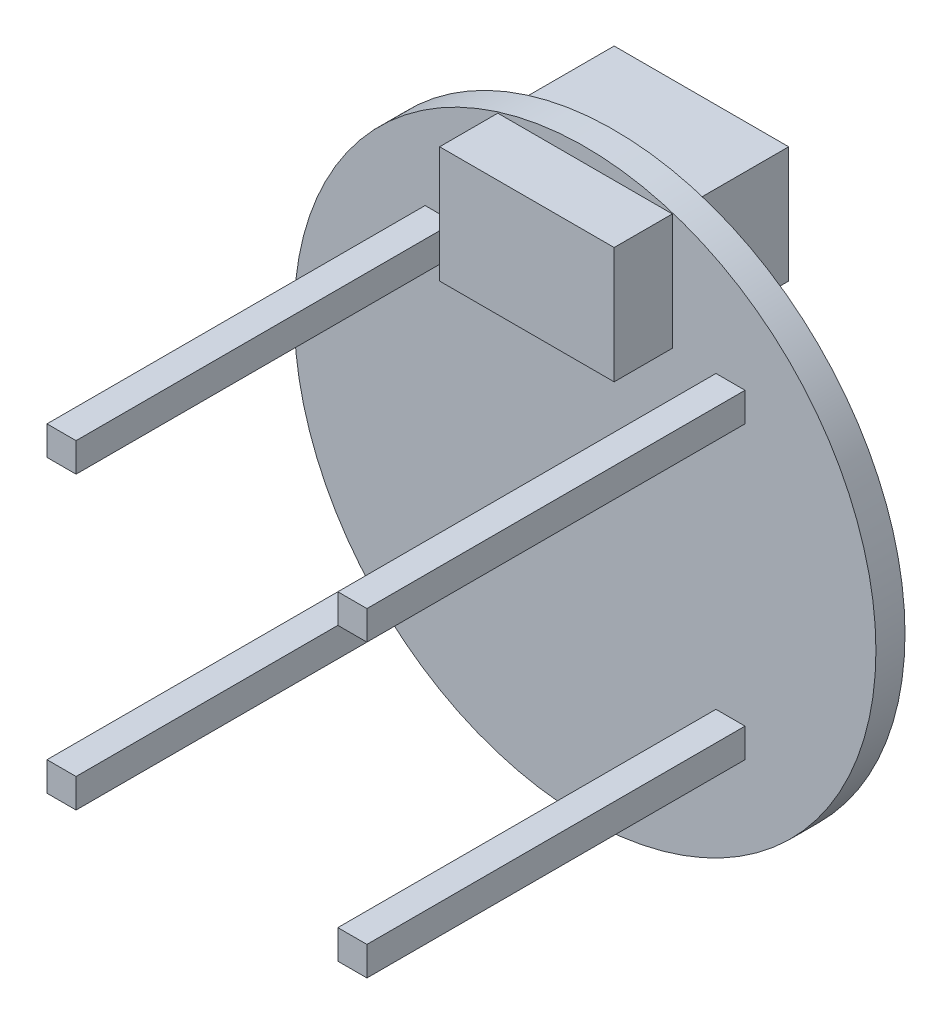
ISO-10303-21;
HEADER;
FILE_DESCRIPTION(('STEP AP214'),'2;1');
FILE_NAME('part.step','',(''),(''),'','','');
FILE_SCHEMA(('AUTOMOTIVE_DESIGN { 1 0 10303 214 1 1 1 1 }'));
ENDSEC;
DATA;
#1=APPLICATION_CONTEXT('core data for automotive mechanical design processes');
#2=APPLICATION_PROTOCOL_DEFINITION('international standard','automotive_design',2000,#1);
#3=PRODUCT_CONTEXT('',#1,'mechanical');
#4=PRODUCT('Part','Part','',(#3));
#5=PRODUCT_RELATED_PRODUCT_CATEGORY('part','',(#4));
#6=PRODUCT_DEFINITION_FORMATION('','',#4);
#7=PRODUCT_DEFINITION_CONTEXT('part definition',#1,'design');
#8=PRODUCT_DEFINITION('design','',#6,#7);
#9=PRODUCT_DEFINITION_SHAPE('','',#8);
#10=(LENGTH_UNIT() NAMED_UNIT(*) SI_UNIT(.MILLI.,.METRE.));
#11=(NAMED_UNIT(*) PLANE_ANGLE_UNIT() SI_UNIT($,.RADIAN.));
#12=(NAMED_UNIT(*) SI_UNIT($,.STERADIAN.) SOLID_ANGLE_UNIT());
#13=UNCERTAINTY_MEASURE_WITH_UNIT(LENGTH_MEASURE(1.E-05),#10,'distance_accuracy_value','');
#14=(GEOMETRIC_REPRESENTATION_CONTEXT(3) GLOBAL_UNCERTAINTY_ASSIGNED_CONTEXT((#13)) GLOBAL_UNIT_ASSIGNED_CONTEXT((#10,
#11,#12)) REPRESENTATION_CONTEXT('',''));
#15=CARTESIAN_POINT('',(0.,0.,0.));
#16=DIRECTION('',(0.,0.,1.));
#17=DIRECTION('',(1.,0.,0.));
#18=AXIS2_PLACEMENT_3D('',#15,#16,#17);
#19=CARTESIAN_POINT('',(0.,0.,50.));
#20=DIRECTION('',(0.,0.,1.));
#21=DIRECTION('',(1.,0.,0.));
#22=AXIS2_PLACEMENT_3D('',#19,#20,#21);
#23=PLANE('',#22);
#24=CARTESIAN_POINT('',(0.,0.,50.));
#25=DIRECTION('',(0.,0.,1.));
#26=DIRECTION('',(1.,0.,0.));
#27=AXIS2_PLACEMENT_3D('',#24,#25,#26);
#28=CIRCLE('',#27,500.);
#29=CARTESIAN_POINT('',(500.,0.,50.));
#30=VERTEX_POINT('',#29);
#31=EDGE_CURVE('E365',#30,#30,#28,.T.);
#32=ORIENTED_EDGE('',*,*,#31,.T.);
#33=EDGE_LOOP('',(#32));
#34=FACE_BOUND('',#33,.T.);
#35=DIRECTION('',(1.,0.,0.));
#36=VECTOR('',#35,1.);
#37=CARTESIAN_POINT('',(0.,275.,50.));
#38=LINE('',#37,#36);
#39=CARTESIAN_POINT('',(225.,275.,50.));
#40=VERTEX_POINT('',#39);
#41=CARTESIAN_POINT('',(275.,275.,50.));
#42=VERTEX_POINT('',#41);
#43=EDGE_CURVE('E358',#40,#42,#38,.T.);
#44=ORIENTED_EDGE('',*,*,#43,.T.);
#45=DIRECTION('',(0.,-1.,0.));
#46=VECTOR('',#45,1.);
#47=CARTESIAN_POINT('',(275.,0.,50.));
#48=LINE('',#47,#46);
#49=CARTESIAN_POINT('',(275.,225.,50.));
#50=VERTEX_POINT('',#49);
#51=EDGE_CURVE('E361',#42,#50,#48,.T.);
#52=ORIENTED_EDGE('',*,*,#51,.T.);
#53=DIRECTION('',(-1.,0.,0.));
#54=VECTOR('',#53,1.);
#55=CARTESIAN_POINT('',(0.,225.,50.));
#56=LINE('',#55,#54);
#57=CARTESIAN_POINT('',(225.,225.,50.));
#58=VERTEX_POINT('',#57);
#59=EDGE_CURVE('E352',#50,#58,#56,.T.);
#60=ORIENTED_EDGE('',*,*,#59,.T.);
#61=DIRECTION('',(0.,1.,0.));
#62=VECTOR('',#61,1.);
#63=CARTESIAN_POINT('',(225.,0.,50.));
#64=LINE('',#63,#62);
#65=EDGE_CURVE('E355',#58,#40,#64,.T.);
#66=ORIENTED_EDGE('',*,*,#65,.T.);
#67=EDGE_LOOP('',(#44,#52,#60,#66));
#68=FACE_BOUND('',#67,.T.);
#69=DIRECTION('',(1.,0.,0.));
#70=VECTOR('',#69,1.);
#71=CARTESIAN_POINT('',(0.,275.,50.));
#72=LINE('',#71,#70);
#73=CARTESIAN_POINT('',(-275.,275.,50.));
#74=VERTEX_POINT('',#73);
#75=CARTESIAN_POINT('',(-225.,275.,50.));
#76=VERTEX_POINT('',#75);
#77=EDGE_CURVE('E326',#74,#76,#72,.T.);
#78=ORIENTED_EDGE('',*,*,#77,.T.);
#79=DIRECTION('',(0.,-1.,0.));
#80=VECTOR('',#79,1.);
#81=CARTESIAN_POINT('',(-225.,0.,50.));
#82=LINE('',#81,#80);
#83=CARTESIAN_POINT('',(-225.,225.,50.));
#84=VERTEX_POINT('',#83);
#85=EDGE_CURVE('E329',#76,#84,#82,.T.);
#86=ORIENTED_EDGE('',*,*,#85,.T.);
#87=DIRECTION('',(-1.,0.,0.));
#88=VECTOR('',#87,1.);
#89=CARTESIAN_POINT('',(0.,225.,50.));
#90=LINE('',#89,#88);
#91=CARTESIAN_POINT('',(-275.,225.,50.));
#92=VERTEX_POINT('',#91);
#93=EDGE_CURVE('E320',#84,#92,#90,.T.);
#94=ORIENTED_EDGE('',*,*,#93,.T.);
#95=DIRECTION('',(0.,1.,0.));
#96=VECTOR('',#95,1.);
#97=CARTESIAN_POINT('',(-275.,0.,50.));
#98=LINE('',#97,#96);
#99=EDGE_CURVE('E323',#92,#74,#98,.T.);
#100=ORIENTED_EDGE('',*,*,#99,.T.);
#101=EDGE_LOOP('',(#78,#86,#94,#100));
#102=FACE_BOUND('',#101,.T.);
#103=DIRECTION('',(1.,0.,0.));
#104=VECTOR('',#103,1.);
#105=CARTESIAN_POINT('',(0.,-225.,50.));
#106=LINE('',#105,#104);
#107=CARTESIAN_POINT('',(225.,-225.,50.));
#108=VERTEX_POINT('',#107);
#109=CARTESIAN_POINT('',(275.,-225.,50.));
#110=VERTEX_POINT('',#109);
#111=EDGE_CURVE('E294',#108,#110,#106,.T.);
#112=ORIENTED_EDGE('',*,*,#111,.T.);
#113=DIRECTION('',(0.,-1.,0.));
#114=VECTOR('',#113,1.);
#115=CARTESIAN_POINT('',(275.,0.,50.));
#116=LINE('',#115,#114);
#117=CARTESIAN_POINT('',(275.,-275.,50.));
#118=VERTEX_POINT('',#117);
#119=EDGE_CURVE('E297',#110,#118,#116,.T.);
#120=ORIENTED_EDGE('',*,*,#119,.T.);
#121=DIRECTION('',(-1.,0.,0.));
#122=VECTOR('',#121,1.);
#123=CARTESIAN_POINT('',(0.,-275.,50.));
#124=LINE('',#123,#122);
#125=CARTESIAN_POINT('',(225.,-275.,50.));
#126=VERTEX_POINT('',#125);
#127=EDGE_CURVE('E288',#118,#126,#124,.T.);
#128=ORIENTED_EDGE('',*,*,#127,.T.);
#129=DIRECTION('',(0.,1.,0.));
#130=VECTOR('',#129,1.);
#131=CARTESIAN_POINT('',(225.,0.,50.));
#132=LINE('',#131,#130);
#133=EDGE_CURVE('E291',#126,#108,#132,.T.);
#134=ORIENTED_EDGE('',*,*,#133,.T.);
#135=EDGE_LOOP('',(#112,#120,#128,#134));
#136=FACE_BOUND('',#135,.T.);
#137=DIRECTION('',(1.,0.,0.));
#138=VECTOR('',#137,1.);
#139=CARTESIAN_POINT('',(0.,-225.,50.));
#140=LINE('',#139,#138);
#141=CARTESIAN_POINT('',(-275.,-225.,50.));
#142=VERTEX_POINT('',#141);
#143=CARTESIAN_POINT('',(-225.,-225.,50.));
#144=VERTEX_POINT('',#143);
#145=EDGE_CURVE('E262',#142,#144,#140,.T.);
#146=ORIENTED_EDGE('',*,*,#145,.T.);
#147=DIRECTION('',(0.,-1.,0.));
#148=VECTOR('',#147,1.);
#149=CARTESIAN_POINT('',(-225.,0.,50.));
#150=LINE('',#149,#148);
#151=CARTESIAN_POINT('',(-225.,-275.,50.));
#152=VERTEX_POINT('',#151);
#153=EDGE_CURVE('E265',#144,#152,#150,.T.);
#154=ORIENTED_EDGE('',*,*,#153,.T.);
#155=DIRECTION('',(-1.,0.,0.));
#156=VECTOR('',#155,1.);
#157=CARTESIAN_POINT('',(0.,-275.,50.));
#158=LINE('',#157,#156);
#159=CARTESIAN_POINT('',(-275.,-275.,50.));
#160=VERTEX_POINT('',#159);
#161=EDGE_CURVE('E256',#152,#160,#158,.T.);
#162=ORIENTED_EDGE('',*,*,#161,.T.);
#163=DIRECTION('',(0.,1.,0.));
#164=VECTOR('',#163,1.);
#165=CARTESIAN_POINT('',(-275.,0.,50.));
#166=LINE('',#165,#164);
#167=EDGE_CURVE('E259',#160,#142,#166,.T.);
#168=ORIENTED_EDGE('',*,*,#167,.T.);
#169=EDGE_LOOP('',(#146,#154,#162,#168));
#170=FACE_BOUND('',#169,.T.);
#171=DIRECTION('',(0.,1.,0.));
#172=VECTOR('',#171,1.);
#173=CARTESIAN_POINT('',(-150.,0.,50.));
#174=LINE('',#173,#172);
#175=CARTESIAN_POINT('',(-150.,275.,50.));
#176=VERTEX_POINT('',#175);
#177=CARTESIAN_POINT('',(-150.,475.,50.));
#178=VERTEX_POINT('',#177);
#179=EDGE_CURVE('E61',#176,#178,#174,.T.);
#180=ORIENTED_EDGE('',*,*,#179,.T.);
#181=DIRECTION('',(1.,0.,0.));
#182=VECTOR('',#181,1.);
#183=CARTESIAN_POINT('',(0.,475.,50.));
#184=LINE('',#183,#182);
#185=CARTESIAN_POINT('',(150.,475.,50.));
#186=VERTEX_POINT('',#185);
#187=EDGE_CURVE('E56',#178,#186,#184,.T.);
#188=ORIENTED_EDGE('',*,*,#187,.T.);
#189=DIRECTION('',(0.,-1.,0.));
#190=VECTOR('',#189,1.);
#191=CARTESIAN_POINT('',(150.,0.,50.));
#192=LINE('',#191,#190);
#193=CARTESIAN_POINT('',(150.,275.,50.));
#194=VERTEX_POINT('',#193);
#195=EDGE_CURVE('E234',#186,#194,#192,.T.);
#196=ORIENTED_EDGE('',*,*,#195,.T.);
#197=DIRECTION('',(1.,0.,0.));
#198=VECTOR('',#197,1.);
#199=CARTESIAN_POINT('',(0.,275.,50.));
#200=LINE('',#199,#198);
#201=EDGE_CURVE('E224',#176,#194,#200,.T.);
#202=ORIENTED_EDGE('',*,*,#201,.F.);
#203=EDGE_LOOP('',(#180,#188,#196,#202));
#204=FACE_BOUND('',#203,.T.);
#205=ADVANCED_FACE('F41',(#34,#68,#102,#136,#170,#204),#23,.T.);
#206=CARTESIAN_POINT('',(0.,0.,0.));
#207=DIRECTION('',(0.,0.,1.));
#208=DIRECTION('',(1.,0.,0.));
#209=AXIS2_PLACEMENT_3D('',#206,#207,#208);
#210=PLANE('',#209);
#211=CARTESIAN_POINT('',(0.,0.,0.));
#212=DIRECTION('',(0.,0.,1.));
#213=DIRECTION('',(1.,0.,0.));
#214=AXIS2_PLACEMENT_3D('',#211,#212,#213);
#215=CIRCLE('',#214,500.);
#216=CARTESIAN_POINT('',(500.,0.,0.));
#217=VERTEX_POINT('',#216);
#218=EDGE_CURVE('E364',#217,#217,#215,.T.);
#219=ORIENTED_EDGE('',*,*,#218,.F.);
#220=EDGE_LOOP('',(#219));
#221=FACE_BOUND('',#220,.T.);
#222=DIRECTION('',(1.,0.,0.));
#223=VECTOR('',#222,1.);
#224=CARTESIAN_POINT('',(0.,475.,0.));
#225=LINE('',#224,#223);
#226=CARTESIAN_POINT('',(-150.,475.,0.));
#227=VERTEX_POINT('',#226);
#228=CARTESIAN_POINT('',(150.,475.,0.));
#229=VERTEX_POINT('',#228);
#230=EDGE_CURVE('E11',#227,#229,#225,.T.);
#231=ORIENTED_EDGE('',*,*,#230,.F.);
#232=DIRECTION('',(0.,1.,0.));
#233=VECTOR('',#232,1.);
#234=CARTESIAN_POINT('',(-150.,0.,0.));
#235=LINE('',#234,#233);
#236=CARTESIAN_POINT('',(-150.,275.,0.));
#237=VERTEX_POINT('',#236);
#238=EDGE_CURVE('E373',#237,#227,#235,.T.);
#239=ORIENTED_EDGE('',*,*,#238,.F.);
#240=DIRECTION('',(1.,0.,0.));
#241=VECTOR('',#240,1.);
#242=CARTESIAN_POINT('',(0.,275.,0.));
#243=LINE('',#242,#241);
#244=CARTESIAN_POINT('',(150.,275.,0.));
#245=VERTEX_POINT('',#244);
#246=EDGE_CURVE('E368',#237,#245,#243,.T.);
#247=ORIENTED_EDGE('',*,*,#246,.T.);
#248=DIRECTION('',(0.,-1.,0.));
#249=VECTOR('',#248,1.);
#250=CARTESIAN_POINT('',(150.,0.,0.));
#251=LINE('',#250,#249);
#252=EDGE_CURVE('E49',#229,#245,#251,.T.);
#253=ORIENTED_EDGE('',*,*,#252,.F.);
#254=EDGE_LOOP('',(#231,#239,#247,#253));
#255=FACE_BOUND('',#254,.T.);
#256=ADVANCED_FACE('F376',(#221,#255),#210,.F.);
#257=CARTESIAN_POINT('',(0.,0.,50.));
#258=DIRECTION('',(0.,0.,-1.));
#259=DIRECTION('',(-1.,0.,0.));
#260=AXIS2_PLACEMENT_3D('',#257,#258,#259);
#261=CYLINDRICAL_SURFACE('',#260,500.);
#262=ORIENTED_EDGE('',*,*,#31,.F.);
#263=EDGE_LOOP('',(#262));
#264=FACE_BOUND('',#263,.T.);
#265=ORIENTED_EDGE('',*,*,#218,.T.);
#266=EDGE_LOOP('',(#265));
#267=FACE_BOUND('',#266,.T.);
#268=ADVANCED_FACE('F43',(#264,#267),#261,.T.);
#269=CARTESIAN_POINT('',(275.,225.,700.));
#270=DIRECTION('',(-1.,0.,0.));
#271=DIRECTION('',(0.,0.,1.));
#272=AXIS2_PLACEMENT_3D('',#269,#270,#271);
#273=PLANE('',#272);
#274=ORIENTED_EDGE('',*,*,#51,.F.);
#275=DIRECTION('',(0.,0.,-1.));
#276=VECTOR('',#275,1.);
#277=CARTESIAN_POINT('',(275.,275.,700.));
#278=LINE('',#277,#276);
#279=CARTESIAN_POINT('',(275.,275.,700.));
#280=VERTEX_POINT('',#279);
#281=EDGE_CURVE('E349',#280,#42,#278,.T.);
#282=ORIENTED_EDGE('',*,*,#281,.F.);
#283=DIRECTION('',(0.,1.,0.));
#284=VECTOR('',#283,1.);
#285=CARTESIAN_POINT('',(275.,225.,700.));
#286=LINE('',#285,#284);
#287=CARTESIAN_POINT('',(275.,225.,700.));
#288=VERTEX_POINT('',#287);
#289=EDGE_CURVE('E332',#288,#280,#286,.T.);
#290=ORIENTED_EDGE('',*,*,#289,.F.);
#291=DIRECTION('',(0.,0.,-1.));
#292=VECTOR('',#291,1.);
#293=CARTESIAN_POINT('',(275.,225.,700.));
#294=LINE('',#293,#292);
#295=EDGE_CURVE('E341',#288,#50,#294,.T.);
#296=ORIENTED_EDGE('',*,*,#295,.T.);
#297=EDGE_LOOP('',(#274,#282,#290,#296));
#298=FACE_BOUND('',#297,.T.);
#299=ADVANCED_FACE('F439',(#298),#273,.F.);
#300=CARTESIAN_POINT('',(225.,275.,700.));
#301=DIRECTION('',(0.,-1.,0.));
#302=DIRECTION('',(0.,0.,-1.));
#303=AXIS2_PLACEMENT_3D('',#300,#301,#302);
#304=PLANE('',#303);
#305=ORIENTED_EDGE('',*,*,#43,.F.);
#306=DIRECTION('',(0.,0.,-1.));
#307=VECTOR('',#306,1.);
#308=CARTESIAN_POINT('',(225.,275.,700.));
#309=LINE('',#308,#307);
#310=CARTESIAN_POINT('',(225.,275.,700.));
#311=VERTEX_POINT('',#310);
#312=EDGE_CURVE('E346',#311,#40,#309,.T.);
#313=ORIENTED_EDGE('',*,*,#312,.F.);
#314=DIRECTION('',(-1.,0.,0.));
#315=VECTOR('',#314,1.);
#316=CARTESIAN_POINT('',(225.,275.,700.));
#317=LINE('',#316,#315);
#318=EDGE_CURVE('E335',#280,#311,#317,.T.);
#319=ORIENTED_EDGE('',*,*,#318,.F.);
#320=ORIENTED_EDGE('',*,*,#281,.T.);
#321=EDGE_LOOP('',(#305,#313,#319,#320));
#322=FACE_BOUND('',#321,.T.);
#323=ADVANCED_FACE('F442',(#322),#304,.F.);
#324=CARTESIAN_POINT('',(225.,225.,700.));
#325=DIRECTION('',(1.,0.,0.));
#326=DIRECTION('',(0.,0.,-1.));
#327=AXIS2_PLACEMENT_3D('',#324,#325,#326);
#328=PLANE('',#327);
#329=ORIENTED_EDGE('',*,*,#65,.F.);
#330=DIRECTION('',(0.,0.,-1.));
#331=VECTOR('',#330,1.);
#332=CARTESIAN_POINT('',(225.,225.,700.));
#333=LINE('',#332,#331);
#334=CARTESIAN_POINT('',(225.,225.,700.));
#335=VERTEX_POINT('',#334);
#336=EDGE_CURVE('E344',#335,#58,#333,.T.);
#337=ORIENTED_EDGE('',*,*,#336,.F.);
#338=DIRECTION('',(0.,-1.,0.));
#339=VECTOR('',#338,1.);
#340=CARTESIAN_POINT('',(225.,225.,700.));
#341=LINE('',#340,#339);
#342=EDGE_CURVE('E337',#311,#335,#341,.T.);
#343=ORIENTED_EDGE('',*,*,#342,.F.);
#344=ORIENTED_EDGE('',*,*,#312,.T.);
#345=EDGE_LOOP('',(#329,#337,#343,#344));
#346=FACE_BOUND('',#345,.T.);
#347=ADVANCED_FACE('F446',(#346),#328,.F.);
#348=CARTESIAN_POINT('',(225.,225.,700.));
#349=DIRECTION('',(0.,1.,0.));
#350=DIRECTION('',(0.,0.,1.));
#351=AXIS2_PLACEMENT_3D('',#348,#349,#350);
#352=PLANE('',#351);
#353=ORIENTED_EDGE('',*,*,#59,.F.);
#354=ORIENTED_EDGE('',*,*,#295,.F.);
#355=DIRECTION('',(1.,0.,0.));
#356=VECTOR('',#355,1.);
#357=CARTESIAN_POINT('',(225.,225.,700.));
#358=LINE('',#357,#356);
#359=EDGE_CURVE('E339',#335,#288,#358,.T.);
#360=ORIENTED_EDGE('',*,*,#359,.F.);
#361=ORIENTED_EDGE('',*,*,#336,.T.);
#362=EDGE_LOOP('',(#353,#354,#360,#361));
#363=FACE_BOUND('',#362,.T.);
#364=ADVANCED_FACE('F450',(#363),#352,.F.);
#365=CARTESIAN_POINT('',(0.,0.,700.));
#366=DIRECTION('',(0.,0.,-1.));
#367=DIRECTION('',(-1.,0.,0.));
#368=AXIS2_PLACEMENT_3D('',#365,#366,#367);
#369=PLANE('',#368);
#370=ORIENTED_EDGE('',*,*,#289,.T.);
#371=ORIENTED_EDGE('',*,*,#318,.T.);
#372=ORIENTED_EDGE('',*,*,#342,.T.);
#373=ORIENTED_EDGE('',*,*,#359,.T.);
#374=EDGE_LOOP('',(#370,#371,#372,#373));
#375=FACE_BOUND('',#374,.T.);
#376=ADVANCED_FACE('F454',(#375),#369,.F.);
#377=CARTESIAN_POINT('',(-225.,225.,700.));
#378=DIRECTION('',(-1.,0.,0.));
#379=DIRECTION('',(0.,0.,1.));
#380=AXIS2_PLACEMENT_3D('',#377,#378,#379);
#381=PLANE('',#380);
#382=ORIENTED_EDGE('',*,*,#85,.F.);
#383=DIRECTION('',(0.,0.,-1.));
#384=VECTOR('',#383,1.);
#385=CARTESIAN_POINT('',(-225.,275.,700.));
#386=LINE('',#385,#384);
#387=CARTESIAN_POINT('',(-225.,275.,700.));
#388=VERTEX_POINT('',#387);
#389=EDGE_CURVE('E317',#388,#76,#386,.T.);
#390=ORIENTED_EDGE('',*,*,#389,.F.);
#391=DIRECTION('',(0.,1.,0.));
#392=VECTOR('',#391,1.);
#393=CARTESIAN_POINT('',(-225.,225.,700.));
#394=LINE('',#393,#392);
#395=CARTESIAN_POINT('',(-225.,225.,700.));
#396=VERTEX_POINT('',#395);
#397=EDGE_CURVE('E300',#396,#388,#394,.T.);
#398=ORIENTED_EDGE('',*,*,#397,.F.);
#399=DIRECTION('',(0.,0.,-1.));
#400=VECTOR('',#399,1.);
#401=CARTESIAN_POINT('',(-225.,225.,700.));
#402=LINE('',#401,#400);
#403=EDGE_CURVE('E309',#396,#84,#402,.T.);
#404=ORIENTED_EDGE('',*,*,#403,.T.);
#405=EDGE_LOOP('',(#382,#390,#398,#404));
#406=FACE_BOUND('',#405,.T.);
#407=ADVANCED_FACE('F458',(#406),#381,.F.);
#408=CARTESIAN_POINT('',(-275.,275.,700.));
#409=DIRECTION('',(0.,-1.,0.));
#410=DIRECTION('',(0.,0.,-1.));
#411=AXIS2_PLACEMENT_3D('',#408,#409,#410);
#412=PLANE('',#411);
#413=ORIENTED_EDGE('',*,*,#77,.F.);
#414=DIRECTION('',(0.,0.,-1.));
#415=VECTOR('',#414,1.);
#416=CARTESIAN_POINT('',(-275.,275.,700.));
#417=LINE('',#416,#415);
#418=CARTESIAN_POINT('',(-275.,275.,700.));
#419=VERTEX_POINT('',#418);
#420=EDGE_CURVE('E314',#419,#74,#417,.T.);
#421=ORIENTED_EDGE('',*,*,#420,.F.);
#422=DIRECTION('',(-1.,0.,0.));
#423=VECTOR('',#422,1.);
#424=CARTESIAN_POINT('',(-275.,275.,700.));
#425=LINE('',#424,#423);
#426=EDGE_CURVE('E303',#388,#419,#425,.T.);
#427=ORIENTED_EDGE('',*,*,#426,.F.);
#428=ORIENTED_EDGE('',*,*,#389,.T.);
#429=EDGE_LOOP('',(#413,#421,#427,#428));
#430=FACE_BOUND('',#429,.T.);
#431=ADVANCED_FACE('F462',(#430),#412,.F.);
#432=CARTESIAN_POINT('',(-275.,225.,700.));
#433=DIRECTION('',(1.,0.,0.));
#434=DIRECTION('',(0.,0.,-1.));
#435=AXIS2_PLACEMENT_3D('',#432,#433,#434);
#436=PLANE('',#435);
#437=ORIENTED_EDGE('',*,*,#99,.F.);
#438=DIRECTION('',(0.,0.,-1.));
#439=VECTOR('',#438,1.);
#440=CARTESIAN_POINT('',(-275.,225.,700.));
#441=LINE('',#440,#439);
#442=CARTESIAN_POINT('',(-275.,225.,700.));
#443=VERTEX_POINT('',#442);
#444=EDGE_CURVE('E312',#443,#92,#441,.T.);
#445=ORIENTED_EDGE('',*,*,#444,.F.);
#446=DIRECTION('',(0.,-1.,0.));
#447=VECTOR('',#446,1.);
#448=CARTESIAN_POINT('',(-275.,225.,700.));
#449=LINE('',#448,#447);
#450=EDGE_CURVE('E305',#419,#443,#449,.T.);
#451=ORIENTED_EDGE('',*,*,#450,.F.);
#452=ORIENTED_EDGE('',*,*,#420,.T.);
#453=EDGE_LOOP('',(#437,#445,#451,#452));
#454=FACE_BOUND('',#453,.T.);
#455=ADVANCED_FACE('F466',(#454),#436,.F.);
#456=CARTESIAN_POINT('',(-275.,225.,700.));
#457=DIRECTION('',(0.,1.,0.));
#458=DIRECTION('',(0.,0.,1.));
#459=AXIS2_PLACEMENT_3D('',#456,#457,#458);
#460=PLANE('',#459);
#461=ORIENTED_EDGE('',*,*,#93,.F.);
#462=ORIENTED_EDGE('',*,*,#403,.F.);
#463=DIRECTION('',(1.,0.,0.));
#464=VECTOR('',#463,1.);
#465=CARTESIAN_POINT('',(-275.,225.,700.));
#466=LINE('',#465,#464);
#467=EDGE_CURVE('E307',#443,#396,#466,.T.);
#468=ORIENTED_EDGE('',*,*,#467,.F.);
#469=ORIENTED_EDGE('',*,*,#444,.T.);
#470=EDGE_LOOP('',(#461,#462,#468,#469));
#471=FACE_BOUND('',#470,.T.);
#472=ADVANCED_FACE('F470',(#471),#460,.F.);
#473=CARTESIAN_POINT('',(0.,0.,700.));
#474=DIRECTION('',(0.,0.,-1.));
#475=DIRECTION('',(-1.,0.,0.));
#476=AXIS2_PLACEMENT_3D('',#473,#474,#475);
#477=PLANE('',#476);
#478=ORIENTED_EDGE('',*,*,#397,.T.);
#479=ORIENTED_EDGE('',*,*,#426,.T.);
#480=ORIENTED_EDGE('',*,*,#450,.T.);
#481=ORIENTED_EDGE('',*,*,#467,.T.);
#482=EDGE_LOOP('',(#478,#479,#480,#481));
#483=FACE_BOUND('',#482,.T.);
#484=ADVANCED_FACE('F474',(#483),#477,.F.);
#485=CARTESIAN_POINT('',(275.,-275.,700.));
#486=DIRECTION('',(-1.,0.,0.));
#487=DIRECTION('',(0.,0.,1.));
#488=AXIS2_PLACEMENT_3D('',#485,#486,#487);
#489=PLANE('',#488);
#490=ORIENTED_EDGE('',*,*,#119,.F.);
#491=DIRECTION('',(0.,0.,-1.));
#492=VECTOR('',#491,1.);
#493=CARTESIAN_POINT('',(275.,-225.,700.));
#494=LINE('',#493,#492);
#495=CARTESIAN_POINT('',(275.,-225.,700.));
#496=VERTEX_POINT('',#495);
#497=EDGE_CURVE('E285',#496,#110,#494,.T.);
#498=ORIENTED_EDGE('',*,*,#497,.F.);
#499=DIRECTION('',(0.,1.,0.));
#500=VECTOR('',#499,1.);
#501=CARTESIAN_POINT('',(275.,-275.,700.));
#502=LINE('',#501,#500);
#503=CARTESIAN_POINT('',(275.,-275.,700.));
#504=VERTEX_POINT('',#503);
#505=EDGE_CURVE('E268',#504,#496,#502,.T.);
#506=ORIENTED_EDGE('',*,*,#505,.F.);
#507=DIRECTION('',(0.,0.,-1.));
#508=VECTOR('',#507,1.);
#509=CARTESIAN_POINT('',(275.,-275.,700.));
#510=LINE('',#509,#508);
#511=EDGE_CURVE('E277',#504,#118,#510,.T.);
#512=ORIENTED_EDGE('',*,*,#511,.T.);
#513=EDGE_LOOP('',(#490,#498,#506,#512));
#514=FACE_BOUND('',#513,.T.);
#515=ADVANCED_FACE('F478',(#514),#489,.F.);
#516=CARTESIAN_POINT('',(225.,-225.,700.));
#517=DIRECTION('',(0.,-1.,0.));
#518=DIRECTION('',(0.,0.,-1.));
#519=AXIS2_PLACEMENT_3D('',#516,#517,#518);
#520=PLANE('',#519);
#521=ORIENTED_EDGE('',*,*,#111,.F.);
#522=DIRECTION('',(0.,0.,-1.));
#523=VECTOR('',#522,1.);
#524=CARTESIAN_POINT('',(225.,-225.,700.));
#525=LINE('',#524,#523);
#526=CARTESIAN_POINT('',(225.,-225.,700.));
#527=VERTEX_POINT('',#526);
#528=EDGE_CURVE('E282',#527,#108,#525,.T.);
#529=ORIENTED_EDGE('',*,*,#528,.F.);
#530=DIRECTION('',(-1.,0.,0.));
#531=VECTOR('',#530,1.);
#532=CARTESIAN_POINT('',(225.,-225.,700.));
#533=LINE('',#532,#531);
#534=EDGE_CURVE('E271',#496,#527,#533,.T.);
#535=ORIENTED_EDGE('',*,*,#534,.F.);
#536=ORIENTED_EDGE('',*,*,#497,.T.);
#537=EDGE_LOOP('',(#521,#529,#535,#536));
#538=FACE_BOUND('',#537,.T.);
#539=ADVANCED_FACE('F482',(#538),#520,.F.);
#540=CARTESIAN_POINT('',(225.,-275.,700.));
#541=DIRECTION('',(1.,0.,0.));
#542=DIRECTION('',(0.,0.,-1.));
#543=AXIS2_PLACEMENT_3D('',#540,#541,#542);
#544=PLANE('',#543);
#545=ORIENTED_EDGE('',*,*,#133,.F.);
#546=DIRECTION('',(0.,0.,-1.));
#547=VECTOR('',#546,1.);
#548=CARTESIAN_POINT('',(225.,-275.,700.));
#549=LINE('',#548,#547);
#550=CARTESIAN_POINT('',(225.,-275.,700.));
#551=VERTEX_POINT('',#550);
#552=EDGE_CURVE('E280',#551,#126,#549,.T.);
#553=ORIENTED_EDGE('',*,*,#552,.F.);
#554=DIRECTION('',(0.,-1.,0.));
#555=VECTOR('',#554,1.);
#556=CARTESIAN_POINT('',(225.,-275.,700.));
#557=LINE('',#556,#555);
#558=EDGE_CURVE('E273',#527,#551,#557,.T.);
#559=ORIENTED_EDGE('',*,*,#558,.F.);
#560=ORIENTED_EDGE('',*,*,#528,.T.);
#561=EDGE_LOOP('',(#545,#553,#559,#560));
#562=FACE_BOUND('',#561,.T.);
#563=ADVANCED_FACE('F486',(#562),#544,.F.);
#564=CARTESIAN_POINT('',(225.,-275.,700.));
#565=DIRECTION('',(0.,1.,0.));
#566=DIRECTION('',(0.,0.,1.));
#567=AXIS2_PLACEMENT_3D('',#564,#565,#566);
#568=PLANE('',#567);
#569=ORIENTED_EDGE('',*,*,#127,.F.);
#570=ORIENTED_EDGE('',*,*,#511,.F.);
#571=DIRECTION('',(1.,0.,0.));
#572=VECTOR('',#571,1.);
#573=CARTESIAN_POINT('',(225.,-275.,700.));
#574=LINE('',#573,#572);
#575=EDGE_CURVE('E275',#551,#504,#574,.T.);
#576=ORIENTED_EDGE('',*,*,#575,.F.);
#577=ORIENTED_EDGE('',*,*,#552,.T.);
#578=EDGE_LOOP('',(#569,#570,#576,#577));
#579=FACE_BOUND('',#578,.T.);
#580=ADVANCED_FACE('F490',(#579),#568,.F.);
#581=CARTESIAN_POINT('',(0.,0.,700.));
#582=DIRECTION('',(0.,0.,-1.));
#583=DIRECTION('',(-1.,0.,0.));
#584=AXIS2_PLACEMENT_3D('',#581,#582,#583);
#585=PLANE('',#584);
#586=ORIENTED_EDGE('',*,*,#505,.T.);
#587=ORIENTED_EDGE('',*,*,#534,.T.);
#588=ORIENTED_EDGE('',*,*,#558,.T.);
#589=ORIENTED_EDGE('',*,*,#575,.T.);
#590=EDGE_LOOP('',(#586,#587,#588,#589));
#591=FACE_BOUND('',#590,.T.);
#592=ADVANCED_FACE('F494',(#591),#585,.F.);
#593=CARTESIAN_POINT('',(-225.,-275.,700.));
#594=DIRECTION('',(-1.,0.,0.));
#595=DIRECTION('',(0.,0.,1.));
#596=AXIS2_PLACEMENT_3D('',#593,#594,#595);
#597=PLANE('',#596);
#598=ORIENTED_EDGE('',*,*,#153,.F.);
#599=DIRECTION('',(0.,0.,-1.));
#600=VECTOR('',#599,1.);
#601=CARTESIAN_POINT('',(-225.,-225.,700.));
#602=LINE('',#601,#600);
#603=CARTESIAN_POINT('',(-225.,-225.,700.));
#604=VERTEX_POINT('',#603);
#605=EDGE_CURVE('E253',#604,#144,#602,.T.);
#606=ORIENTED_EDGE('',*,*,#605,.F.);
#607=DIRECTION('',(0.,1.,0.));
#608=VECTOR('',#607,1.);
#609=CARTESIAN_POINT('',(-225.,-275.,700.));
#610=LINE('',#609,#608);
#611=CARTESIAN_POINT('',(-225.,-275.,700.));
#612=VERTEX_POINT('',#611);
#613=EDGE_CURVE('E236',#612,#604,#610,.T.);
#614=ORIENTED_EDGE('',*,*,#613,.F.);
#615=DIRECTION('',(0.,0.,-1.));
#616=VECTOR('',#615,1.);
#617=CARTESIAN_POINT('',(-225.,-275.,700.));
#618=LINE('',#617,#616);
#619=EDGE_CURVE('E245',#612,#152,#618,.T.);
#620=ORIENTED_EDGE('',*,*,#619,.T.);
#621=EDGE_LOOP('',(#598,#606,#614,#620));
#622=FACE_BOUND('',#621,.T.);
#623=ADVANCED_FACE('F498',(#622),#597,.F.);
#624=CARTESIAN_POINT('',(-275.,-225.,700.));
#625=DIRECTION('',(0.,-1.,0.));
#626=DIRECTION('',(0.,0.,-1.));
#627=AXIS2_PLACEMENT_3D('',#624,#625,#626);
#628=PLANE('',#627);
#629=ORIENTED_EDGE('',*,*,#145,.F.);
#630=DIRECTION('',(0.,0.,-1.));
#631=VECTOR('',#630,1.);
#632=CARTESIAN_POINT('',(-275.,-225.,700.));
#633=LINE('',#632,#631);
#634=CARTESIAN_POINT('',(-275.,-225.,700.));
#635=VERTEX_POINT('',#634);
#636=EDGE_CURVE('E250',#635,#142,#633,.T.);
#637=ORIENTED_EDGE('',*,*,#636,.F.);
#638=DIRECTION('',(-1.,0.,0.));
#639=VECTOR('',#638,1.);
#640=CARTESIAN_POINT('',(-275.,-225.,700.));
#641=LINE('',#640,#639);
#642=EDGE_CURVE('E239',#604,#635,#641,.T.);
#643=ORIENTED_EDGE('',*,*,#642,.F.);
#644=ORIENTED_EDGE('',*,*,#605,.T.);
#645=EDGE_LOOP('',(#629,#637,#643,#644));
#646=FACE_BOUND('',#645,.T.);
#647=ADVANCED_FACE('F502',(#646),#628,.F.);
#648=CARTESIAN_POINT('',(-275.,-275.,700.));
#649=DIRECTION('',(1.,0.,0.));
#650=DIRECTION('',(0.,0.,-1.));
#651=AXIS2_PLACEMENT_3D('',#648,#649,#650);
#652=PLANE('',#651);
#653=ORIENTED_EDGE('',*,*,#167,.F.);
#654=DIRECTION('',(0.,0.,-1.));
#655=VECTOR('',#654,1.);
#656=CARTESIAN_POINT('',(-275.,-275.,700.));
#657=LINE('',#656,#655);
#658=CARTESIAN_POINT('',(-275.,-275.,700.));
#659=VERTEX_POINT('',#658);
#660=EDGE_CURVE('E248',#659,#160,#657,.T.);
#661=ORIENTED_EDGE('',*,*,#660,.F.);
#662=DIRECTION('',(0.,-1.,0.));
#663=VECTOR('',#662,1.);
#664=CARTESIAN_POINT('',(-275.,-275.,700.));
#665=LINE('',#664,#663);
#666=EDGE_CURVE('E241',#635,#659,#665,.T.);
#667=ORIENTED_EDGE('',*,*,#666,.F.);
#668=ORIENTED_EDGE('',*,*,#636,.T.);
#669=EDGE_LOOP('',(#653,#661,#667,#668));
#670=FACE_BOUND('',#669,.T.);
#671=ADVANCED_FACE('F506',(#670),#652,.F.);
#672=CARTESIAN_POINT('',(-275.,-275.,700.));
#673=DIRECTION('',(0.,1.,0.));
#674=DIRECTION('',(0.,0.,1.));
#675=AXIS2_PLACEMENT_3D('',#672,#673,#674);
#676=PLANE('',#675);
#677=ORIENTED_EDGE('',*,*,#161,.F.);
#678=ORIENTED_EDGE('',*,*,#619,.F.);
#679=DIRECTION('',(1.,0.,0.));
#680=VECTOR('',#679,1.);
#681=CARTESIAN_POINT('',(-275.,-275.,700.));
#682=LINE('',#681,#680);
#683=EDGE_CURVE('E243',#659,#612,#682,.T.);
#684=ORIENTED_EDGE('',*,*,#683,.F.);
#685=ORIENTED_EDGE('',*,*,#660,.T.);
#686=EDGE_LOOP('',(#677,#678,#684,#685));
#687=FACE_BOUND('',#686,.T.);
#688=ADVANCED_FACE('F510',(#687),#676,.F.);
#689=CARTESIAN_POINT('',(0.,0.,700.));
#690=DIRECTION('',(0.,0.,-1.));
#691=DIRECTION('',(-1.,0.,0.));
#692=AXIS2_PLACEMENT_3D('',#689,#690,#691);
#693=PLANE('',#692);
#694=ORIENTED_EDGE('',*,*,#613,.T.);
#695=ORIENTED_EDGE('',*,*,#642,.T.);
#696=ORIENTED_EDGE('',*,*,#666,.T.);
#697=ORIENTED_EDGE('',*,*,#683,.T.);
#698=EDGE_LOOP('',(#694,#695,#696,#697));
#699=FACE_BOUND('',#698,.T.);
#700=ADVANCED_FACE('F514',(#699),#693,.F.);
#701=CARTESIAN_POINT('',(-150.,475.,-150.));
#702=DIRECTION('',(0.,0.,1.));
#703=DIRECTION('',(1.,0.,0.));
#704=AXIS2_PLACEMENT_3D('',#701,#702,#703);
#705=PLANE('',#704);
#706=DIRECTION('',(-1.,0.,0.));
#707=VECTOR('',#706,1.);
#708=CARTESIAN_POINT('',(-150.,275.,-150.));
#709=LINE('',#708,#707);
#710=CARTESIAN_POINT('',(150.,275.,-150.));
#711=VERTEX_POINT('',#710);
#712=CARTESIAN_POINT('',(-150.,275.,-150.));
#713=VERTEX_POINT('',#712);
#714=EDGE_CURVE('E387',#711,#713,#709,.T.);
#715=ORIENTED_EDGE('',*,*,#714,.T.);
#716=DIRECTION('',(0.,-1.,0.));
#717=VECTOR('',#716,1.);
#718=CARTESIAN_POINT('',(-150.,475.,-150.));
#719=LINE('',#718,#717);
#720=CARTESIAN_POINT('',(-150.,475.,-150.));
#721=VERTEX_POINT('',#720);
#722=EDGE_CURVE('E217',#721,#713,#719,.T.);
#723=ORIENTED_EDGE('',*,*,#722,.F.);
#724=DIRECTION('',(-1.,0.,0.));
#725=VECTOR('',#724,1.);
#726=CARTESIAN_POINT('',(-150.,475.,-150.));
#727=LINE('',#726,#725);
#728=CARTESIAN_POINT('',(150.,475.,-150.));
#729=VERTEX_POINT('',#728);
#730=EDGE_CURVE('E202',#729,#721,#727,.T.);
#731=ORIENTED_EDGE('',*,*,#730,.F.);
#732=DIRECTION('',(0.,-1.,0.));
#733=VECTOR('',#732,1.);
#734=CARTESIAN_POINT('',(150.,475.,-150.));
#735=LINE('',#734,#733);
#736=EDGE_CURVE('E215',#729,#711,#735,.T.);
#737=ORIENTED_EDGE('',*,*,#736,.T.);
#738=EDGE_LOOP('',(#715,#723,#731,#737));
#739=FACE_BOUND('',#738,.T.);
#740=ADVANCED_FACE('F214',(#739),#705,.F.);
#741=CARTESIAN_POINT('',(0.,475.,0.));
#742=DIRECTION('',(0.,-1.,0.));
#743=DIRECTION('',(0.,0.,-1.));
#744=AXIS2_PLACEMENT_3D('',#741,#742,#743);
#745=PLANE('',#744);
#746=DIRECTION('',(0.,0.,1.));
#747=VECTOR('',#746,1.);
#748=CARTESIAN_POINT('',(-150.,475.,150.));
#749=LINE('',#748,#747);
#750=EDGE_CURVE('E412',#721,#227,#749,.T.);
#751=ORIENTED_EDGE('',*,*,#750,.T.);
#752=ORIENTED_EDGE('',*,*,#230,.T.);
#753=DIRECTION('',(0.,0.,-1.));
#754=VECTOR('',#753,1.);
#755=CARTESIAN_POINT('',(150.,475.,150.));
#756=LINE('',#755,#754);
#757=EDGE_CURVE('E198',#229,#729,#756,.T.);
#758=ORIENTED_EDGE('',*,*,#757,.T.);
#759=ORIENTED_EDGE('',*,*,#730,.T.);
#760=EDGE_LOOP('',(#751,#752,#758,#759));
#761=FACE_BOUND('',#760,.T.);
#762=ADVANCED_FACE('F201',(#761),#745,.F.);
#763=CARTESIAN_POINT('',(0.,275.,0.));
#764=DIRECTION('',(0.,-1.,0.));
#765=DIRECTION('',(0.,0.,-1.));
#766=AXIS2_PLACEMENT_3D('',#763,#764,#765);
#767=PLANE('',#766);
#768=ORIENTED_EDGE('',*,*,#246,.F.);
#769=DIRECTION('',(0.,0.,1.));
#770=VECTOR('',#769,1.);
#771=CARTESIAN_POINT('',(-150.,275.,150.));
#772=LINE('',#771,#770);
#773=EDGE_CURVE('E381',#713,#237,#772,.T.);
#774=ORIENTED_EDGE('',*,*,#773,.F.);
#775=ORIENTED_EDGE('',*,*,#714,.F.);
#776=DIRECTION('',(0.,0.,-1.));
#777=VECTOR('',#776,1.);
#778=CARTESIAN_POINT('',(150.,275.,150.));
#779=LINE('',#778,#777);
#780=EDGE_CURVE('E222',#245,#711,#779,.T.);
#781=ORIENTED_EDGE('',*,*,#780,.F.);
#782=EDGE_LOOP('',(#768,#774,#775,#781));
#783=FACE_BOUND('',#782,.T.);
#784=ADVANCED_FACE('F380',(#783),#767,.T.);
#785=CARTESIAN_POINT('',(-150.,475.,150.));
#786=DIRECTION('',(1.,0.,0.));
#787=DIRECTION('',(0.,0.,-1.));
#788=AXIS2_PLACEMENT_3D('',#785,#786,#787);
#789=PLANE('',#788);
#790=ORIENTED_EDGE('',*,*,#773,.T.);
#791=ORIENTED_EDGE('',*,*,#238,.T.);
#792=ORIENTED_EDGE('',*,*,#750,.F.);
#793=ORIENTED_EDGE('',*,*,#722,.T.);
#794=EDGE_LOOP('',(#790,#791,#792,#793));
#795=FACE_BOUND('',#794,.T.);
#796=ADVANCED_FACE('F383',(#795),#789,.F.);
#797=CARTESIAN_POINT('',(150.,475.,150.));
#798=DIRECTION('',(-1.,0.,0.));
#799=DIRECTION('',(0.,0.,1.));
#800=AXIS2_PLACEMENT_3D('',#797,#798,#799);
#801=PLANE('',#800);
#802=ORIENTED_EDGE('',*,*,#757,.F.);
#803=ORIENTED_EDGE('',*,*,#252,.T.);
#804=ORIENTED_EDGE('',*,*,#780,.T.);
#805=ORIENTED_EDGE('',*,*,#736,.F.);
#806=EDGE_LOOP('',(#802,#803,#804,#805));
#807=FACE_BOUND('',#806,.T.);
#808=ADVANCED_FACE('F221',(#807),#801,.F.);
#809=ORIENTED_EDGE('',*,*,#195,.F.);
#810=CARTESIAN_POINT('',(150.,475.,150.));
#811=VERTEX_POINT('',#810);
#812=EDGE_CURVE('E209',#811,#186,#756,.T.);
#813=ORIENTED_EDGE('',*,*,#812,.F.);
#814=DIRECTION('',(0.,-1.,0.));
#815=VECTOR('',#814,1.);
#816=CARTESIAN_POINT('',(150.,475.,150.));
#817=LINE('',#816,#815);
#818=CARTESIAN_POINT('',(150.,275.,150.));
#819=VERTEX_POINT('',#818);
#820=EDGE_CURVE('E391',#811,#819,#817,.T.);
#821=ORIENTED_EDGE('',*,*,#820,.T.);
#822=EDGE_CURVE('E408',#819,#194,#779,.T.);
#823=ORIENTED_EDGE('',*,*,#822,.T.);
#824=EDGE_LOOP('',(#809,#813,#821,#823));
#825=FACE_BOUND('',#824,.T.);
#826=ADVANCED_FACE('F417',(#825),#801,.F.);
#827=ORIENTED_EDGE('',*,*,#179,.F.);
#828=CARTESIAN_POINT('',(-150.,275.,150.));
#829=VERTEX_POINT('',#828);
#830=EDGE_CURVE('E384',#176,#829,#772,.T.);
#831=ORIENTED_EDGE('',*,*,#830,.T.);
#832=DIRECTION('',(0.,-1.,0.));
#833=VECTOR('',#832,1.);
#834=CARTESIAN_POINT('',(-150.,475.,150.));
#835=LINE('',#834,#833);
#836=CARTESIAN_POINT('',(-150.,475.,150.));
#837=VERTEX_POINT('',#836);
#838=EDGE_CURVE('E228',#837,#829,#835,.T.);
#839=ORIENTED_EDGE('',*,*,#838,.F.);
#840=EDGE_CURVE('E219',#178,#837,#749,.T.);
#841=ORIENTED_EDGE('',*,*,#840,.F.);
#842=EDGE_LOOP('',(#827,#831,#839,#841));
#843=FACE_BOUND('',#842,.T.);
#844=ADVANCED_FACE('F418',(#843),#789,.F.);
#845=CARTESIAN_POINT('',(-150.,475.,150.));
#846=DIRECTION('',(0.,0.,-1.));
#847=DIRECTION('',(-1.,0.,0.));
#848=AXIS2_PLACEMENT_3D('',#845,#846,#847);
#849=PLANE('',#848);
#850=DIRECTION('',(1.,0.,0.));
#851=VECTOR('',#850,1.);
#852=CARTESIAN_POINT('',(-150.,275.,150.));
#853=LINE('',#852,#851);
#854=EDGE_CURVE('E210',#829,#819,#853,.T.);
#855=ORIENTED_EDGE('',*,*,#854,.T.);
#856=ORIENTED_EDGE('',*,*,#820,.F.);
#857=DIRECTION('',(1.,0.,0.));
#858=VECTOR('',#857,1.);
#859=CARTESIAN_POINT('',(-150.,475.,150.));
#860=LINE('',#859,#858);
#861=EDGE_CURVE('E393',#837,#811,#860,.T.);
#862=ORIENTED_EDGE('',*,*,#861,.F.);
#863=ORIENTED_EDGE('',*,*,#838,.T.);
#864=EDGE_LOOP('',(#855,#856,#862,#863));
#865=FACE_BOUND('',#864,.T.);
#866=ADVANCED_FACE('F399',(#865),#849,.F.);
#867=ORIENTED_EDGE('',*,*,#187,.F.);
#868=ORIENTED_EDGE('',*,*,#840,.T.);
#869=ORIENTED_EDGE('',*,*,#861,.T.);
#870=ORIENTED_EDGE('',*,*,#812,.T.);
#871=EDGE_LOOP('',(#867,#868,#869,#870));
#872=FACE_BOUND('',#871,.T.);
#873=ADVANCED_FACE('F416',(#872),#745,.F.);
#874=ORIENTED_EDGE('',*,*,#830,.F.);
#875=ORIENTED_EDGE('',*,*,#201,.T.);
#876=ORIENTED_EDGE('',*,*,#822,.F.);
#877=ORIENTED_EDGE('',*,*,#854,.F.);
#878=EDGE_LOOP('',(#874,#875,#876,#877));
#879=FACE_BOUND('',#878,.T.);
#880=ADVANCED_FACE('F406',(#879),#767,.T.);
#881=CLOSED_SHELL('',(#205,#256,#268,#299,#323,#347,#364,#376,#407,#431,#455,#472,#484,#515,
#539,#563,#580,#592,#623,#647,#671,#688,#700,#740,#762,#784,#796,#808,#826,#844,#866,#873,#880));
#882=MANIFOLD_SOLID_BREP('B2',#881);
#883=ADVANCED_BREP_SHAPE_REPRESENTATION('',(#18,#882),#14);
#884=SHAPE_DEFINITION_REPRESENTATION(#9,#883);
ENDSEC;
END-ISO-10303-21;
